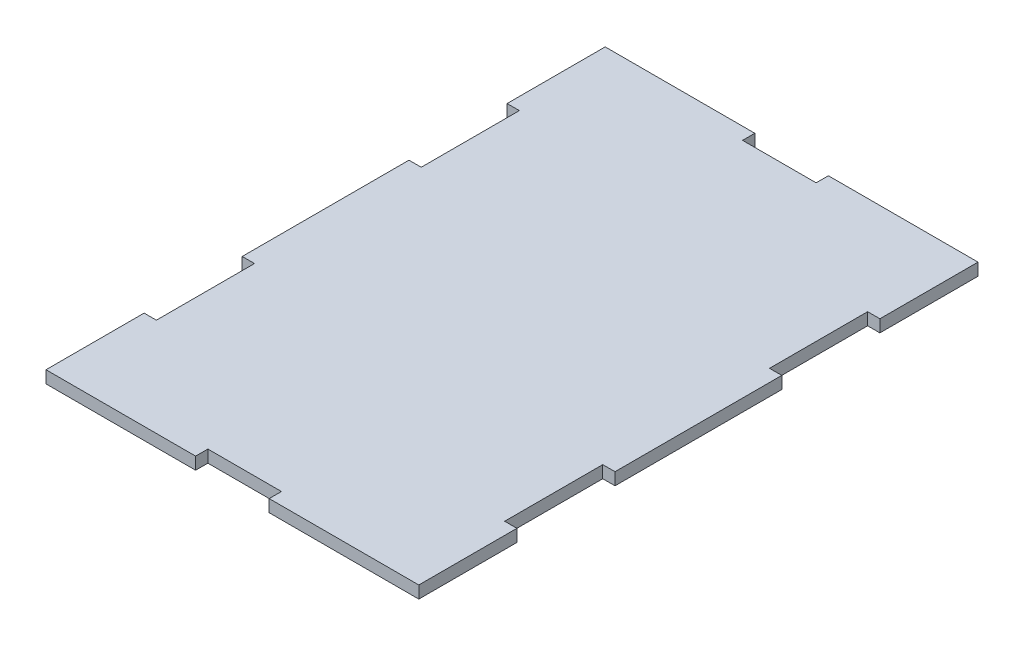
ISO-10303-21;
HEADER;
FILE_DESCRIPTION(('STEP AP214'),'2;1');
FILE_NAME('part.step','',(''),(''),'','','');
FILE_SCHEMA(('AUTOMOTIVE_DESIGN { 1 0 10303 214 1 1 1 1 }'));
ENDSEC;
DATA;
#1=APPLICATION_CONTEXT('core data for automotive mechanical design processes');
#2=APPLICATION_PROTOCOL_DEFINITION('international standard','automotive_design',2000,#1);
#3=PRODUCT_CONTEXT('',#1,'mechanical');
#4=PRODUCT('Part','Part','',(#3));
#5=PRODUCT_RELATED_PRODUCT_CATEGORY('part','',(#4));
#6=PRODUCT_DEFINITION_FORMATION('','',#4);
#7=PRODUCT_DEFINITION_CONTEXT('part definition',#1,'design');
#8=PRODUCT_DEFINITION('design','',#6,#7);
#9=PRODUCT_DEFINITION_SHAPE('','',#8);
#10=(LENGTH_UNIT() NAMED_UNIT(*) SI_UNIT(.MILLI.,.METRE.));
#11=(NAMED_UNIT(*) PLANE_ANGLE_UNIT() SI_UNIT($,.RADIAN.));
#12=(NAMED_UNIT(*) SI_UNIT($,.STERADIAN.) SOLID_ANGLE_UNIT());
#13=UNCERTAINTY_MEASURE_WITH_UNIT(LENGTH_MEASURE(1.E-05),#10,'distance_accuracy_value','');
#14=(GEOMETRIC_REPRESENTATION_CONTEXT(3) GLOBAL_UNCERTAINTY_ASSIGNED_CONTEXT((#13)) GLOBAL_UNIT_ASSIGNED_CONTEXT((#10,
#11,#12)) REPRESENTATION_CONTEXT('',''));
#15=CARTESIAN_POINT('',(0.,0.,0.));
#16=DIRECTION('',(0.,0.,1.));
#17=DIRECTION('',(1.,0.,0.));
#18=AXIS2_PLACEMENT_3D('',#15,#16,#17);
#19=CARTESIAN_POINT('',(0.,3.175,0.));
#20=DIRECTION('',(1.,0.,0.));
#21=DIRECTION('',(0.,0.,-1.));
#22=AXIS2_PLACEMENT_3D('',#19,#20,#21);
#23=PLANE('',#22);
#24=DIRECTION('',(0.,0.,1.));
#25=VECTOR('',#24,1.);
#26=CARTESIAN_POINT('',(0.,0.,0.));
#27=LINE('',#26,#25);
#28=CARTESIAN_POINT('',(0.,0.,-25.4));
#29=VERTEX_POINT('',#28);
#30=CARTESIAN_POINT('',(0.,0.,0.));
#31=VERTEX_POINT('',#30);
#32=EDGE_CURVE('E249',#29,#31,#27,.T.);
#33=ORIENTED_EDGE('',*,*,#32,.T.);
#34=DIRECTION('',(0.,-1.,0.));
#35=VECTOR('',#34,1.);
#36=CARTESIAN_POINT('',(0.,3.175,0.));
#37=LINE('',#36,#35);
#38=CARTESIAN_POINT('',(0.,3.175,0.));
#39=VERTEX_POINT('',#38);
#40=EDGE_CURVE('E11',#39,#31,#37,.T.);
#41=ORIENTED_EDGE('',*,*,#40,.F.);
#42=DIRECTION('',(0.,0.,1.));
#43=VECTOR('',#42,1.);
#44=CARTESIAN_POINT('',(0.,3.175,0.));
#45=LINE('',#44,#43);
#46=CARTESIAN_POINT('',(0.,3.175,-25.4));
#47=VERTEX_POINT('',#46);
#48=EDGE_CURVE('E303',#47,#39,#45,.T.);
#49=ORIENTED_EDGE('',*,*,#48,.F.);
#50=DIRECTION('',(0.,-1.,0.));
#51=VECTOR('',#50,1.);
#52=CARTESIAN_POINT('',(0.,3.175,-25.4));
#53=LINE('',#52,#51);
#54=EDGE_CURVE('E245',#47,#29,#53,.T.);
#55=ORIENTED_EDGE('',*,*,#54,.T.);
#56=EDGE_LOOP('',(#33,#41,#49,#55));
#57=FACE_BOUND('',#56,.T.);
#58=ADVANCED_FACE('F33',(#57),#23,.F.);
#59=CARTESIAN_POINT('',(0.,3.175,0.));
#60=DIRECTION('',(0.,0.,-1.));
#61=DIRECTION('',(-1.,0.,0.));
#62=AXIS2_PLACEMENT_3D('',#59,#60,#61);
#63=PLANE('',#62);
#64=DIRECTION('',(1.,0.,0.));
#65=VECTOR('',#64,1.);
#66=CARTESIAN_POINT('',(0.,0.,0.));
#67=LINE('',#66,#65);
#68=CARTESIAN_POINT('',(38.735,0.,0.));
#69=VERTEX_POINT('',#68);
#70=EDGE_CURVE('E252',#31,#69,#67,.T.);
#71=ORIENTED_EDGE('',*,*,#70,.T.);
#72=DIRECTION('',(0.,-1.,0.));
#73=VECTOR('',#72,1.);
#74=CARTESIAN_POINT('',(38.735,3.175,0.));
#75=LINE('',#74,#73);
#76=CARTESIAN_POINT('',(38.735,3.175,0.));
#77=VERTEX_POINT('',#76);
#78=EDGE_CURVE('E41',#77,#69,#75,.T.);
#79=ORIENTED_EDGE('',*,*,#78,.F.);
#80=DIRECTION('',(1.,0.,0.));
#81=VECTOR('',#80,1.);
#82=CARTESIAN_POINT('',(0.,3.175,0.));
#83=LINE('',#82,#81);
#84=EDGE_CURVE('E152',#39,#77,#83,.T.);
#85=ORIENTED_EDGE('',*,*,#84,.F.);
#86=ORIENTED_EDGE('',*,*,#40,.T.);
#87=EDGE_LOOP('',(#71,#79,#85,#86));
#88=FACE_BOUND('',#87,.T.);
#89=ADVANCED_FACE('F461',(#88),#63,.F.);
#90=CARTESIAN_POINT('',(38.735,3.175,0.));
#91=DIRECTION('',(-1.,0.,0.));
#92=DIRECTION('',(0.,0.,1.));
#93=AXIS2_PLACEMENT_3D('',#90,#91,#92);
#94=PLANE('',#93);
#95=DIRECTION('',(0.,0.,-1.));
#96=VECTOR('',#95,1.);
#97=CARTESIAN_POINT('',(38.735,0.,0.));
#98=LINE('',#97,#96);
#99=CARTESIAN_POINT('',(38.735,0.,-3.17500000000001));
#100=VERTEX_POINT('',#99);
#101=EDGE_CURVE('E254',#69,#100,#98,.T.);
#102=ORIENTED_EDGE('',*,*,#101,.T.);
#103=DIRECTION('',(0.,-1.,0.));
#104=VECTOR('',#103,1.);
#105=CARTESIAN_POINT('',(38.735,3.175,-3.17500000000001));
#106=LINE('',#105,#104);
#107=CARTESIAN_POINT('',(38.735,3.175,-3.17500000000001));
#108=VERTEX_POINT('',#107);
#109=EDGE_CURVE('E370',#108,#100,#106,.T.);
#110=ORIENTED_EDGE('',*,*,#109,.F.);
#111=DIRECTION('',(0.,0.,-1.));
#112=VECTOR('',#111,1.);
#113=CARTESIAN_POINT('',(38.735,3.175,0.));
#114=LINE('',#113,#112);
#115=EDGE_CURVE('E378',#77,#108,#114,.T.);
#116=ORIENTED_EDGE('',*,*,#115,.F.);
#117=ORIENTED_EDGE('',*,*,#78,.T.);
#118=EDGE_LOOP('',(#102,#110,#116,#117));
#119=FACE_BOUND('',#118,.T.);
#120=ADVANCED_FACE('F376',(#119),#94,.F.);
#121=CARTESIAN_POINT('',(38.735,3.175,-3.17500000000001));
#122=DIRECTION('',(0.,0.,-1.));
#123=DIRECTION('',(-1.,0.,0.));
#124=AXIS2_PLACEMENT_3D('',#121,#122,#123);
#125=PLANE('',#124);
#126=DIRECTION('',(1.,0.,0.));
#127=VECTOR('',#126,1.);
#128=CARTESIAN_POINT('',(38.735,0.,-3.17500000000001));
#129=LINE('',#128,#127);
#130=CARTESIAN_POINT('',(57.785,0.,-3.17500000000001));
#131=VERTEX_POINT('',#130);
#132=EDGE_CURVE('E256',#100,#131,#129,.T.);
#133=ORIENTED_EDGE('',*,*,#132,.T.);
#134=DIRECTION('',(0.,-1.,0.));
#135=VECTOR('',#134,1.);
#136=CARTESIAN_POINT('',(57.785,3.175,-3.17500000000001));
#137=LINE('',#136,#135);
#138=CARTESIAN_POINT('',(57.785,3.175,-3.17500000000001));
#139=VERTEX_POINT('',#138);
#140=EDGE_CURVE('E367',#139,#131,#137,.T.);
#141=ORIENTED_EDGE('',*,*,#140,.F.);
#142=DIRECTION('',(1.,0.,0.));
#143=VECTOR('',#142,1.);
#144=CARTESIAN_POINT('',(38.735,3.175,-3.17500000000001));
#145=LINE('',#144,#143);
#146=EDGE_CURVE('E396',#108,#139,#145,.T.);
#147=ORIENTED_EDGE('',*,*,#146,.F.);
#148=ORIENTED_EDGE('',*,*,#109,.T.);
#149=EDGE_LOOP('',(#133,#141,#147,#148));
#150=FACE_BOUND('',#149,.T.);
#151=ADVANCED_FACE('F387',(#150),#125,.F.);
#152=CARTESIAN_POINT('',(57.785,3.175,-3.17500000000001));
#153=DIRECTION('',(1.,0.,0.));
#154=DIRECTION('',(0.,0.,-1.));
#155=AXIS2_PLACEMENT_3D('',#152,#153,#154);
#156=PLANE('',#155);
#157=DIRECTION('',(0.,0.,1.));
#158=VECTOR('',#157,1.);
#159=CARTESIAN_POINT('',(57.785,0.,-3.17500000000001));
#160=LINE('',#159,#158);
#161=CARTESIAN_POINT('',(57.785,0.,0.));
#162=VERTEX_POINT('',#161);
#163=EDGE_CURVE('E258',#131,#162,#160,.T.);
#164=ORIENTED_EDGE('',*,*,#163,.T.);
#165=DIRECTION('',(0.,-1.,0.));
#166=VECTOR('',#165,1.);
#167=CARTESIAN_POINT('',(57.785,3.175,0.));
#168=LINE('',#167,#166);
#169=CARTESIAN_POINT('',(57.785,3.175,0.));
#170=VERTEX_POINT('',#169);
#171=EDGE_CURVE('E364',#170,#162,#168,.T.);
#172=ORIENTED_EDGE('',*,*,#171,.F.);
#173=DIRECTION('',(0.,0.,1.));
#174=VECTOR('',#173,1.);
#175=CARTESIAN_POINT('',(57.785,3.175,-3.17500000000001));
#176=LINE('',#175,#174);
#177=EDGE_CURVE('E393',#139,#170,#176,.T.);
#178=ORIENTED_EDGE('',*,*,#177,.F.);
#179=ORIENTED_EDGE('',*,*,#140,.T.);
#180=EDGE_LOOP('',(#164,#172,#178,#179));
#181=FACE_BOUND('',#180,.T.);
#182=ADVANCED_FACE('F391',(#181),#156,.F.);
#183=CARTESIAN_POINT('',(57.785,3.175,0.));
#184=DIRECTION('',(0.,0.,-1.));
#185=DIRECTION('',(-1.,0.,0.));
#186=AXIS2_PLACEMENT_3D('',#183,#184,#185);
#187=PLANE('',#186);
#188=DIRECTION('',(1.,0.,0.));
#189=VECTOR('',#188,1.);
#190=CARTESIAN_POINT('',(57.785,0.,0.));
#191=LINE('',#190,#189);
#192=CARTESIAN_POINT('',(96.52,0.,0.));
#193=VERTEX_POINT('',#192);
#194=EDGE_CURVE('E260',#162,#193,#191,.T.);
#195=ORIENTED_EDGE('',*,*,#194,.T.);
#196=DIRECTION('',(0.,-1.,0.));
#197=VECTOR('',#196,1.);
#198=CARTESIAN_POINT('',(96.52,3.175,0.));
#199=LINE('',#198,#197);
#200=CARTESIAN_POINT('',(96.52,3.175,0.));
#201=VERTEX_POINT('',#200);
#202=EDGE_CURVE('E361',#201,#193,#199,.T.);
#203=ORIENTED_EDGE('',*,*,#202,.F.);
#204=DIRECTION('',(1.,0.,0.));
#205=VECTOR('',#204,1.);
#206=CARTESIAN_POINT('',(57.785,3.175,0.));
#207=LINE('',#206,#205);
#208=EDGE_CURVE('E395',#170,#201,#207,.T.);
#209=ORIENTED_EDGE('',*,*,#208,.F.);
#210=ORIENTED_EDGE('',*,*,#171,.T.);
#211=EDGE_LOOP('',(#195,#203,#209,#210));
#212=FACE_BOUND('',#211,.T.);
#213=ADVANCED_FACE('F474',(#212),#187,.F.);
#214=CARTESIAN_POINT('',(96.52,3.175,0.));
#215=DIRECTION('',(-1.,0.,0.));
#216=DIRECTION('',(0.,0.,1.));
#217=AXIS2_PLACEMENT_3D('',#214,#215,#216);
#218=PLANE('',#217);
#219=DIRECTION('',(0.,0.,-1.));
#220=VECTOR('',#219,1.);
#221=CARTESIAN_POINT('',(96.52,0.,0.));
#222=LINE('',#221,#220);
#223=CARTESIAN_POINT('',(96.52,0.,-25.4));
#224=VERTEX_POINT('',#223);
#225=EDGE_CURVE('E262',#193,#224,#222,.T.);
#226=ORIENTED_EDGE('',*,*,#225,.T.);
#227=DIRECTION('',(0.,-1.,0.));
#228=VECTOR('',#227,1.);
#229=CARTESIAN_POINT('',(96.52,3.175,-25.4));
#230=LINE('',#229,#228);
#231=CARTESIAN_POINT('',(96.52,3.175,-25.4));
#232=VERTEX_POINT('',#231);
#233=EDGE_CURVE('E358',#232,#224,#230,.T.);
#234=ORIENTED_EDGE('',*,*,#233,.F.);
#235=DIRECTION('',(0.,0.,-1.));
#236=VECTOR('',#235,1.);
#237=CARTESIAN_POINT('',(96.52,3.175,0.));
#238=LINE('',#237,#236);
#239=EDGE_CURVE('E398',#201,#232,#238,.T.);
#240=ORIENTED_EDGE('',*,*,#239,.F.);
#241=ORIENTED_EDGE('',*,*,#202,.T.);
#242=EDGE_LOOP('',(#226,#234,#240,#241));
#243=FACE_BOUND('',#242,.T.);
#244=ADVANCED_FACE('F477',(#243),#218,.F.);
#245=CARTESIAN_POINT('',(96.52,3.175,-25.4));
#246=DIRECTION('',(0.,0.,1.));
#247=DIRECTION('',(1.,0.,0.));
#248=AXIS2_PLACEMENT_3D('',#245,#246,#247);
#249=PLANE('',#248);
#250=DIRECTION('',(-1.,0.,0.));
#251=VECTOR('',#250,1.);
#252=CARTESIAN_POINT('',(96.52,0.,-25.4));
#253=LINE('',#252,#251);
#254=CARTESIAN_POINT('',(93.345,0.,-25.4));
#255=VERTEX_POINT('',#254);
#256=EDGE_CURVE('E264',#224,#255,#253,.T.);
#257=ORIENTED_EDGE('',*,*,#256,.T.);
#258=DIRECTION('',(0.,-1.,0.));
#259=VECTOR('',#258,1.);
#260=CARTESIAN_POINT('',(93.345,3.175,-25.4));
#261=LINE('',#260,#259);
#262=CARTESIAN_POINT('',(93.345,3.175,-25.4));
#263=VERTEX_POINT('',#262);
#264=EDGE_CURVE('E355',#263,#255,#261,.T.);
#265=ORIENTED_EDGE('',*,*,#264,.F.);
#266=DIRECTION('',(-1.,0.,0.));
#267=VECTOR('',#266,1.);
#268=CARTESIAN_POINT('',(96.52,3.175,-25.4));
#269=LINE('',#268,#267);
#270=EDGE_CURVE('E404',#232,#263,#269,.T.);
#271=ORIENTED_EDGE('',*,*,#270,.F.);
#272=ORIENTED_EDGE('',*,*,#233,.T.);
#273=EDGE_LOOP('',(#257,#265,#271,#272));
#274=FACE_BOUND('',#273,.T.);
#275=ADVANCED_FACE('F481',(#274),#249,.F.);
#276=CARTESIAN_POINT('',(93.345,3.175,-25.4));
#277=DIRECTION('',(-1.,0.,0.));
#278=DIRECTION('',(0.,0.,1.));
#279=AXIS2_PLACEMENT_3D('',#276,#277,#278);
#280=PLANE('',#279);
#281=DIRECTION('',(0.,0.,-1.));
#282=VECTOR('',#281,1.);
#283=CARTESIAN_POINT('',(93.345,0.,-25.4));
#284=LINE('',#283,#282);
#285=CARTESIAN_POINT('',(93.345,0.,-50.8));
#286=VERTEX_POINT('',#285);
#287=EDGE_CURVE('E266',#255,#286,#284,.T.);
#288=ORIENTED_EDGE('',*,*,#287,.T.);
#289=DIRECTION('',(0.,-1.,0.));
#290=VECTOR('',#289,1.);
#291=CARTESIAN_POINT('',(93.345,3.175,-50.8));
#292=LINE('',#291,#290);
#293=CARTESIAN_POINT('',(93.345,3.175,-50.8));
#294=VERTEX_POINT('',#293);
#295=EDGE_CURVE('E352',#294,#286,#292,.T.);
#296=ORIENTED_EDGE('',*,*,#295,.F.);
#297=DIRECTION('',(0.,0.,-1.));
#298=VECTOR('',#297,1.);
#299=CARTESIAN_POINT('',(93.345,3.175,-25.4));
#300=LINE('',#299,#298);
#301=EDGE_CURVE('E406',#263,#294,#300,.T.);
#302=ORIENTED_EDGE('',*,*,#301,.F.);
#303=ORIENTED_EDGE('',*,*,#264,.T.);
#304=EDGE_LOOP('',(#288,#296,#302,#303));
#305=FACE_BOUND('',#304,.T.);
#306=ADVANCED_FACE('F485',(#305),#280,.F.);
#307=CARTESIAN_POINT('',(93.345,3.175,-50.8));
#308=DIRECTION('',(0.,0.,-1.));
#309=DIRECTION('',(-1.,0.,0.));
#310=AXIS2_PLACEMENT_3D('',#307,#308,#309);
#311=PLANE('',#310);
#312=DIRECTION('',(1.,0.,0.));
#313=VECTOR('',#312,1.);
#314=CARTESIAN_POINT('',(93.345,0.,-50.8));
#315=LINE('',#314,#313);
#316=CARTESIAN_POINT('',(96.52,0.,-50.8));
#317=VERTEX_POINT('',#316);
#318=EDGE_CURVE('E268',#286,#317,#315,.T.);
#319=ORIENTED_EDGE('',*,*,#318,.T.);
#320=DIRECTION('',(0.,-1.,0.));
#321=VECTOR('',#320,1.);
#322=CARTESIAN_POINT('',(96.52,3.175,-50.8));
#323=LINE('',#322,#321);
#324=CARTESIAN_POINT('',(96.52,3.175,-50.8));
#325=VERTEX_POINT('',#324);
#326=EDGE_CURVE('E349',#325,#317,#323,.T.);
#327=ORIENTED_EDGE('',*,*,#326,.F.);
#328=DIRECTION('',(1.,0.,0.));
#329=VECTOR('',#328,1.);
#330=CARTESIAN_POINT('',(93.345,3.175,-50.8));
#331=LINE('',#330,#329);
#332=EDGE_CURVE('E408',#294,#325,#331,.T.);
#333=ORIENTED_EDGE('',*,*,#332,.F.);
#334=ORIENTED_EDGE('',*,*,#295,.T.);
#335=EDGE_LOOP('',(#319,#327,#333,#334));
#336=FACE_BOUND('',#335,.T.);
#337=ADVANCED_FACE('F489',(#336),#311,.F.);
#338=CARTESIAN_POINT('',(96.52,3.175,-50.8));
#339=DIRECTION('',(-1.,0.,0.));
#340=DIRECTION('',(0.,0.,1.));
#341=AXIS2_PLACEMENT_3D('',#338,#339,#340);
#342=PLANE('',#341);
#343=DIRECTION('',(0.,0.,-1.));
#344=VECTOR('',#343,1.);
#345=CARTESIAN_POINT('',(96.52,0.,-50.8));
#346=LINE('',#345,#344);
#347=CARTESIAN_POINT('',(96.52,0.,-93.98));
#348=VERTEX_POINT('',#347);
#349=EDGE_CURVE('E270',#317,#348,#346,.T.);
#350=ORIENTED_EDGE('',*,*,#349,.T.);
#351=DIRECTION('',(0.,-1.,0.));
#352=VECTOR('',#351,1.);
#353=CARTESIAN_POINT('',(96.52,3.175,-93.98));
#354=LINE('',#353,#352);
#355=CARTESIAN_POINT('',(96.52,3.175,-93.98));
#356=VERTEX_POINT('',#355);
#357=EDGE_CURVE('E346',#356,#348,#354,.T.);
#358=ORIENTED_EDGE('',*,*,#357,.F.);
#359=DIRECTION('',(0.,0.,-1.));
#360=VECTOR('',#359,1.);
#361=CARTESIAN_POINT('',(96.52,3.175,-50.8));
#362=LINE('',#361,#360);
#363=EDGE_CURVE('E410',#325,#356,#362,.T.);
#364=ORIENTED_EDGE('',*,*,#363,.F.);
#365=ORIENTED_EDGE('',*,*,#326,.T.);
#366=EDGE_LOOP('',(#350,#358,#364,#365));
#367=FACE_BOUND('',#366,.T.);
#368=ADVANCED_FACE('F493',(#367),#342,.F.);
#369=CARTESIAN_POINT('',(93.345,3.175,-93.98));
#370=DIRECTION('',(0.,0.,1.));
#371=DIRECTION('',(1.,0.,0.));
#372=AXIS2_PLACEMENT_3D('',#369,#370,#371);
#373=PLANE('',#372);
#374=DIRECTION('',(-1.,0.,0.));
#375=VECTOR('',#374,1.);
#376=CARTESIAN_POINT('',(93.345,0.,-93.98));
#377=LINE('',#376,#375);
#378=CARTESIAN_POINT('',(93.345,0.,-93.98));
#379=VERTEX_POINT('',#378);
#380=EDGE_CURVE('E272',#348,#379,#377,.T.);
#381=ORIENTED_EDGE('',*,*,#380,.T.);
#382=DIRECTION('',(0.,-1.,0.));
#383=VECTOR('',#382,1.);
#384=CARTESIAN_POINT('',(93.345,3.175,-93.98));
#385=LINE('',#384,#383);
#386=CARTESIAN_POINT('',(93.345,3.175,-93.98));
#387=VERTEX_POINT('',#386);
#388=EDGE_CURVE('E343',#387,#379,#385,.T.);
#389=ORIENTED_EDGE('',*,*,#388,.F.);
#390=DIRECTION('',(-1.,0.,0.));
#391=VECTOR('',#390,1.);
#392=CARTESIAN_POINT('',(93.345,3.175,-93.98));
#393=LINE('',#392,#391);
#394=EDGE_CURVE('E412',#356,#387,#393,.T.);
#395=ORIENTED_EDGE('',*,*,#394,.F.);
#396=ORIENTED_EDGE('',*,*,#357,.T.);
#397=EDGE_LOOP('',(#381,#389,#395,#396));
#398=FACE_BOUND('',#397,.T.);
#399=ADVANCED_FACE('F497',(#398),#373,.F.);
#400=CARTESIAN_POINT('',(93.345,3.175,-119.38));
#401=DIRECTION('',(-1.,0.,0.));
#402=DIRECTION('',(0.,0.,1.));
#403=AXIS2_PLACEMENT_3D('',#400,#401,#402);
#404=PLANE('',#403);
#405=DIRECTION('',(0.,0.,-1.));
#406=VECTOR('',#405,1.);
#407=CARTESIAN_POINT('',(93.345,0.,-119.38));
#408=LINE('',#407,#406);
#409=CARTESIAN_POINT('',(93.345,0.,-119.38));
#410=VERTEX_POINT('',#409);
#411=EDGE_CURVE('E274',#379,#410,#408,.T.);
#412=ORIENTED_EDGE('',*,*,#411,.T.);
#413=DIRECTION('',(0.,-1.,0.));
#414=VECTOR('',#413,1.);
#415=CARTESIAN_POINT('',(93.345,3.175,-119.38));
#416=LINE('',#415,#414);
#417=CARTESIAN_POINT('',(93.345,3.175,-119.38));
#418=VERTEX_POINT('',#417);
#419=EDGE_CURVE('E340',#418,#410,#416,.T.);
#420=ORIENTED_EDGE('',*,*,#419,.F.);
#421=DIRECTION('',(0.,0.,-1.));
#422=VECTOR('',#421,1.);
#423=CARTESIAN_POINT('',(93.345,3.175,-119.38));
#424=LINE('',#423,#422);
#425=EDGE_CURVE('E414',#387,#418,#424,.T.);
#426=ORIENTED_EDGE('',*,*,#425,.F.);
#427=ORIENTED_EDGE('',*,*,#388,.T.);
#428=EDGE_LOOP('',(#412,#420,#426,#427));
#429=FACE_BOUND('',#428,.T.);
#430=ADVANCED_FACE('F501',(#429),#404,.F.);
#431=CARTESIAN_POINT('',(96.52,3.175,-119.38));
#432=DIRECTION('',(0.,0.,-1.));
#433=DIRECTION('',(-1.,0.,0.));
#434=AXIS2_PLACEMENT_3D('',#431,#432,#433);
#435=PLANE('',#434);
#436=DIRECTION('',(1.,0.,0.));
#437=VECTOR('',#436,1.);
#438=CARTESIAN_POINT('',(96.52,0.,-119.38));
#439=LINE('',#438,#437);
#440=CARTESIAN_POINT('',(96.52,0.,-119.38));
#441=VERTEX_POINT('',#440);
#442=EDGE_CURVE('E276',#410,#441,#439,.T.);
#443=ORIENTED_EDGE('',*,*,#442,.T.);
#444=DIRECTION('',(0.,-1.,0.));
#445=VECTOR('',#444,1.);
#446=CARTESIAN_POINT('',(96.52,3.175,-119.38));
#447=LINE('',#446,#445);
#448=CARTESIAN_POINT('',(96.52,3.175,-119.38));
#449=VERTEX_POINT('',#448);
#450=EDGE_CURVE('E337',#449,#441,#447,.T.);
#451=ORIENTED_EDGE('',*,*,#450,.F.);
#452=DIRECTION('',(1.,0.,0.));
#453=VECTOR('',#452,1.);
#454=CARTESIAN_POINT('',(96.52,3.175,-119.38));
#455=LINE('',#454,#453);
#456=EDGE_CURVE('E416',#418,#449,#455,.T.);
#457=ORIENTED_EDGE('',*,*,#456,.F.);
#458=ORIENTED_EDGE('',*,*,#419,.T.);
#459=EDGE_LOOP('',(#443,#451,#457,#458));
#460=FACE_BOUND('',#459,.T.);
#461=ADVANCED_FACE('F505',(#460),#435,.F.);
#462=CARTESIAN_POINT('',(96.52,3.175,-119.38));
#463=DIRECTION('',(-1.,0.,0.));
#464=DIRECTION('',(0.,0.,1.));
#465=AXIS2_PLACEMENT_3D('',#462,#463,#464);
#466=PLANE('',#465);
#467=DIRECTION('',(0.,0.,-1.));
#468=VECTOR('',#467,1.);
#469=CARTESIAN_POINT('',(96.52,0.,-119.38));
#470=LINE('',#469,#468);
#471=CARTESIAN_POINT('',(96.52,0.,-144.78));
#472=VERTEX_POINT('',#471);
#473=EDGE_CURVE('E278',#441,#472,#470,.T.);
#474=ORIENTED_EDGE('',*,*,#473,.T.);
#475=DIRECTION('',(0.,-1.,0.));
#476=VECTOR('',#475,1.);
#477=CARTESIAN_POINT('',(96.52,3.175,-144.78));
#478=LINE('',#477,#476);
#479=CARTESIAN_POINT('',(96.52,3.175,-144.78));
#480=VERTEX_POINT('',#479);
#481=EDGE_CURVE('E334',#480,#472,#478,.T.);
#482=ORIENTED_EDGE('',*,*,#481,.F.);
#483=DIRECTION('',(0.,0.,-1.));
#484=VECTOR('',#483,1.);
#485=CARTESIAN_POINT('',(96.52,3.175,-119.38));
#486=LINE('',#485,#484);
#487=EDGE_CURVE('E418',#449,#480,#486,.T.);
#488=ORIENTED_EDGE('',*,*,#487,.F.);
#489=ORIENTED_EDGE('',*,*,#450,.T.);
#490=EDGE_LOOP('',(#474,#482,#488,#489));
#491=FACE_BOUND('',#490,.T.);
#492=ADVANCED_FACE('F509',(#491),#466,.F.);
#493=CARTESIAN_POINT('',(57.785,3.175,-144.78));
#494=DIRECTION('',(0.,0.,1.));
#495=DIRECTION('',(1.,0.,0.));
#496=AXIS2_PLACEMENT_3D('',#493,#494,#495);
#497=PLANE('',#496);
#498=DIRECTION('',(-1.,0.,0.));
#499=VECTOR('',#498,1.);
#500=CARTESIAN_POINT('',(57.785,0.,-144.78));
#501=LINE('',#500,#499);
#502=CARTESIAN_POINT('',(57.785,0.,-144.78));
#503=VERTEX_POINT('',#502);
#504=EDGE_CURVE('E280',#472,#503,#501,.T.);
#505=ORIENTED_EDGE('',*,*,#504,.T.);
#506=DIRECTION('',(0.,-1.,0.));
#507=VECTOR('',#506,1.);
#508=CARTESIAN_POINT('',(57.785,3.175,-144.78));
#509=LINE('',#508,#507);
#510=CARTESIAN_POINT('',(57.785,3.175,-144.78));
#511=VERTEX_POINT('',#510);
#512=EDGE_CURVE('E331',#511,#503,#509,.T.);
#513=ORIENTED_EDGE('',*,*,#512,.F.);
#514=DIRECTION('',(-1.,0.,0.));
#515=VECTOR('',#514,1.);
#516=CARTESIAN_POINT('',(57.785,3.175,-144.78));
#517=LINE('',#516,#515);
#518=EDGE_CURVE('E420',#480,#511,#517,.T.);
#519=ORIENTED_EDGE('',*,*,#518,.F.);
#520=ORIENTED_EDGE('',*,*,#481,.T.);
#521=EDGE_LOOP('',(#505,#513,#519,#520));
#522=FACE_BOUND('',#521,.T.);
#523=ADVANCED_FACE('F513',(#522),#497,.F.);
#524=CARTESIAN_POINT('',(57.785,3.175,-141.605));
#525=DIRECTION('',(1.,0.,0.));
#526=DIRECTION('',(0.,0.,-1.));
#527=AXIS2_PLACEMENT_3D('',#524,#525,#526);
#528=PLANE('',#527);
#529=DIRECTION('',(0.,0.,1.));
#530=VECTOR('',#529,1.);
#531=CARTESIAN_POINT('',(57.785,0.,-141.605));
#532=LINE('',#531,#530);
#533=CARTESIAN_POINT('',(57.785,0.,-141.605));
#534=VERTEX_POINT('',#533);
#535=EDGE_CURVE('E282',#503,#534,#532,.T.);
#536=ORIENTED_EDGE('',*,*,#535,.T.);
#537=DIRECTION('',(0.,-1.,0.));
#538=VECTOR('',#537,1.);
#539=CARTESIAN_POINT('',(57.785,3.175,-141.605));
#540=LINE('',#539,#538);
#541=CARTESIAN_POINT('',(57.785,3.175,-141.605));
#542=VERTEX_POINT('',#541);
#543=EDGE_CURVE('E328',#542,#534,#540,.T.);
#544=ORIENTED_EDGE('',*,*,#543,.F.);
#545=DIRECTION('',(0.,0.,1.));
#546=VECTOR('',#545,1.);
#547=CARTESIAN_POINT('',(57.785,3.175,-141.605));
#548=LINE('',#547,#546);
#549=EDGE_CURVE('E422',#511,#542,#548,.T.);
#550=ORIENTED_EDGE('',*,*,#549,.F.);
#551=ORIENTED_EDGE('',*,*,#512,.T.);
#552=EDGE_LOOP('',(#536,#544,#550,#551));
#553=FACE_BOUND('',#552,.T.);
#554=ADVANCED_FACE('F517',(#553),#528,.F.);
#555=CARTESIAN_POINT('',(38.735,3.175,-141.605));
#556=DIRECTION('',(0.,0.,1.));
#557=DIRECTION('',(1.,0.,0.));
#558=AXIS2_PLACEMENT_3D('',#555,#556,#557);
#559=PLANE('',#558);
#560=DIRECTION('',(-1.,0.,0.));
#561=VECTOR('',#560,1.);
#562=CARTESIAN_POINT('',(38.735,0.,-141.605));
#563=LINE('',#562,#561);
#564=CARTESIAN_POINT('',(38.735,0.,-141.605));
#565=VERTEX_POINT('',#564);
#566=EDGE_CURVE('E284',#534,#565,#563,.T.);
#567=ORIENTED_EDGE('',*,*,#566,.T.);
#568=DIRECTION('',(0.,-1.,0.));
#569=VECTOR('',#568,1.);
#570=CARTESIAN_POINT('',(38.735,3.175,-141.605));
#571=LINE('',#570,#569);
#572=CARTESIAN_POINT('',(38.735,3.175,-141.605));
#573=VERTEX_POINT('',#572);
#574=EDGE_CURVE('E325',#573,#565,#571,.T.);
#575=ORIENTED_EDGE('',*,*,#574,.F.);
#576=DIRECTION('',(-1.,0.,0.));
#577=VECTOR('',#576,1.);
#578=CARTESIAN_POINT('',(38.735,3.175,-141.605));
#579=LINE('',#578,#577);
#580=EDGE_CURVE('E424',#542,#573,#579,.T.);
#581=ORIENTED_EDGE('',*,*,#580,.F.);
#582=ORIENTED_EDGE('',*,*,#543,.T.);
#583=EDGE_LOOP('',(#567,#575,#581,#582));
#584=FACE_BOUND('',#583,.T.);
#585=ADVANCED_FACE('F521',(#584),#559,.F.);
#586=CARTESIAN_POINT('',(38.735,3.175,-144.78));
#587=DIRECTION('',(-1.,0.,0.));
#588=DIRECTION('',(0.,0.,1.));
#589=AXIS2_PLACEMENT_3D('',#586,#587,#588);
#590=PLANE('',#589);
#591=DIRECTION('',(0.,0.,-1.));
#592=VECTOR('',#591,1.);
#593=CARTESIAN_POINT('',(38.735,0.,-144.78));
#594=LINE('',#593,#592);
#595=CARTESIAN_POINT('',(38.735,0.,-144.78));
#596=VERTEX_POINT('',#595);
#597=EDGE_CURVE('E286',#565,#596,#594,.T.);
#598=ORIENTED_EDGE('',*,*,#597,.T.);
#599=DIRECTION('',(0.,-1.,0.));
#600=VECTOR('',#599,1.);
#601=CARTESIAN_POINT('',(38.735,3.175,-144.78));
#602=LINE('',#601,#600);
#603=CARTESIAN_POINT('',(38.735,3.175,-144.78));
#604=VERTEX_POINT('',#603);
#605=EDGE_CURVE('E322',#604,#596,#602,.T.);
#606=ORIENTED_EDGE('',*,*,#605,.F.);
#607=DIRECTION('',(0.,0.,-1.));
#608=VECTOR('',#607,1.);
#609=CARTESIAN_POINT('',(38.735,3.175,-144.78));
#610=LINE('',#609,#608);
#611=EDGE_CURVE('E426',#573,#604,#610,.T.);
#612=ORIENTED_EDGE('',*,*,#611,.F.);
#613=ORIENTED_EDGE('',*,*,#574,.T.);
#614=EDGE_LOOP('',(#598,#606,#612,#613));
#615=FACE_BOUND('',#614,.T.);
#616=ADVANCED_FACE('F525',(#615),#590,.F.);
#617=CARTESIAN_POINT('',(0.,3.175,-144.78));
#618=DIRECTION('',(0.,0.,1.));
#619=DIRECTION('',(1.,0.,0.));
#620=AXIS2_PLACEMENT_3D('',#617,#618,#619);
#621=PLANE('',#620);
#622=DIRECTION('',(-1.,0.,0.));
#623=VECTOR('',#622,1.);
#624=CARTESIAN_POINT('',(0.,0.,-144.78));
#625=LINE('',#624,#623);
#626=CARTESIAN_POINT('',(0.,0.,-144.78));
#627=VERTEX_POINT('',#626);
#628=EDGE_CURVE('E288',#596,#627,#625,.T.);
#629=ORIENTED_EDGE('',*,*,#628,.T.);
#630=DIRECTION('',(0.,-1.,0.));
#631=VECTOR('',#630,1.);
#632=CARTESIAN_POINT('',(0.,3.175,-144.78));
#633=LINE('',#632,#631);
#634=CARTESIAN_POINT('',(0.,3.175,-144.78));
#635=VERTEX_POINT('',#634);
#636=EDGE_CURVE('E319',#635,#627,#633,.T.);
#637=ORIENTED_EDGE('',*,*,#636,.F.);
#638=DIRECTION('',(-1.,0.,0.));
#639=VECTOR('',#638,1.);
#640=CARTESIAN_POINT('',(0.,3.175,-144.78));
#641=LINE('',#640,#639);
#642=EDGE_CURVE('E428',#604,#635,#641,.T.);
#643=ORIENTED_EDGE('',*,*,#642,.F.);
#644=ORIENTED_EDGE('',*,*,#605,.T.);
#645=EDGE_LOOP('',(#629,#637,#643,#644));
#646=FACE_BOUND('',#645,.T.);
#647=ADVANCED_FACE('F529',(#646),#621,.F.);
#648=CARTESIAN_POINT('',(0.,3.175,-119.38));
#649=DIRECTION('',(1.,0.,0.));
#650=DIRECTION('',(0.,0.,-1.));
#651=AXIS2_PLACEMENT_3D('',#648,#649,#650);
#652=PLANE('',#651);
#653=DIRECTION('',(0.,0.,1.));
#654=VECTOR('',#653,1.);
#655=CARTESIAN_POINT('',(0.,0.,-119.38));
#656=LINE('',#655,#654);
#657=CARTESIAN_POINT('',(0.,0.,-119.38));
#658=VERTEX_POINT('',#657);
#659=EDGE_CURVE('E290',#627,#658,#656,.T.);
#660=ORIENTED_EDGE('',*,*,#659,.T.);
#661=DIRECTION('',(0.,-1.,0.));
#662=VECTOR('',#661,1.);
#663=CARTESIAN_POINT('',(0.,3.175,-119.38));
#664=LINE('',#663,#662);
#665=CARTESIAN_POINT('',(0.,3.175,-119.38));
#666=VERTEX_POINT('',#665);
#667=EDGE_CURVE('E316',#666,#658,#664,.T.);
#668=ORIENTED_EDGE('',*,*,#667,.F.);
#669=DIRECTION('',(0.,0.,1.));
#670=VECTOR('',#669,1.);
#671=CARTESIAN_POINT('',(0.,3.175,-119.38));
#672=LINE('',#671,#670);
#673=EDGE_CURVE('E430',#635,#666,#672,.T.);
#674=ORIENTED_EDGE('',*,*,#673,.F.);
#675=ORIENTED_EDGE('',*,*,#636,.T.);
#676=EDGE_LOOP('',(#660,#668,#674,#675));
#677=FACE_BOUND('',#676,.T.);
#678=ADVANCED_FACE('F533',(#677),#652,.F.);
#679=CARTESIAN_POINT('',(0.,3.175,-119.38));
#680=DIRECTION('',(0.,0.,-1.));
#681=DIRECTION('',(-1.,0.,0.));
#682=AXIS2_PLACEMENT_3D('',#679,#680,#681);
#683=PLANE('',#682);
#684=DIRECTION('',(1.,0.,0.));
#685=VECTOR('',#684,1.);
#686=CARTESIAN_POINT('',(0.,0.,-119.38));
#687=LINE('',#686,#685);
#688=CARTESIAN_POINT('',(3.175,0.,-119.38));
#689=VERTEX_POINT('',#688);
#690=EDGE_CURVE('E292',#658,#689,#687,.T.);
#691=ORIENTED_EDGE('',*,*,#690,.T.);
#692=DIRECTION('',(0.,-1.,0.));
#693=VECTOR('',#692,1.);
#694=CARTESIAN_POINT('',(3.175,3.175,-119.38));
#695=LINE('',#694,#693);
#696=CARTESIAN_POINT('',(3.175,3.175,-119.38));
#697=VERTEX_POINT('',#696);
#698=EDGE_CURVE('E313',#697,#689,#695,.T.);
#699=ORIENTED_EDGE('',*,*,#698,.F.);
#700=DIRECTION('',(1.,0.,0.));
#701=VECTOR('',#700,1.);
#702=CARTESIAN_POINT('',(0.,3.175,-119.38));
#703=LINE('',#702,#701);
#704=EDGE_CURVE('E432',#666,#697,#703,.T.);
#705=ORIENTED_EDGE('',*,*,#704,.F.);
#706=ORIENTED_EDGE('',*,*,#667,.T.);
#707=EDGE_LOOP('',(#691,#699,#705,#706));
#708=FACE_BOUND('',#707,.T.);
#709=ADVANCED_FACE('F537',(#708),#683,.F.);
#710=CARTESIAN_POINT('',(3.175,3.175,-119.38));
#711=DIRECTION('',(1.,0.,0.));
#712=DIRECTION('',(0.,0.,-1.));
#713=AXIS2_PLACEMENT_3D('',#710,#711,#712);
#714=PLANE('',#713);
#715=DIRECTION('',(0.,0.,1.));
#716=VECTOR('',#715,1.);
#717=CARTESIAN_POINT('',(3.175,0.,-119.38));
#718=LINE('',#717,#716);
#719=CARTESIAN_POINT('',(3.175,0.,-93.98));
#720=VERTEX_POINT('',#719);
#721=EDGE_CURVE('E294',#689,#720,#718,.T.);
#722=ORIENTED_EDGE('',*,*,#721,.T.);
#723=DIRECTION('',(0.,-1.,0.));
#724=VECTOR('',#723,1.);
#725=CARTESIAN_POINT('',(3.175,3.175,-93.98));
#726=LINE('',#725,#724);
#727=CARTESIAN_POINT('',(3.175,3.175,-93.98));
#728=VERTEX_POINT('',#727);
#729=EDGE_CURVE('E310',#728,#720,#726,.T.);
#730=ORIENTED_EDGE('',*,*,#729,.F.);
#731=DIRECTION('',(0.,0.,1.));
#732=VECTOR('',#731,1.);
#733=CARTESIAN_POINT('',(3.175,3.175,-119.38));
#734=LINE('',#733,#732);
#735=EDGE_CURVE('E434',#697,#728,#734,.T.);
#736=ORIENTED_EDGE('',*,*,#735,.F.);
#737=ORIENTED_EDGE('',*,*,#698,.T.);
#738=EDGE_LOOP('',(#722,#730,#736,#737));
#739=FACE_BOUND('',#738,.T.);
#740=ADVANCED_FACE('F541',(#739),#714,.F.);
#741=CARTESIAN_POINT('',(3.175,3.175,-93.98));
#742=DIRECTION('',(0.,0.,1.));
#743=DIRECTION('',(1.,0.,0.));
#744=AXIS2_PLACEMENT_3D('',#741,#742,#743);
#745=PLANE('',#744);
#746=DIRECTION('',(-1.,0.,0.));
#747=VECTOR('',#746,1.);
#748=CARTESIAN_POINT('',(3.175,0.,-93.98));
#749=LINE('',#748,#747);
#750=CARTESIAN_POINT('',(0.,0.,-93.98));
#751=VERTEX_POINT('',#750);
#752=EDGE_CURVE('E296',#720,#751,#749,.T.);
#753=ORIENTED_EDGE('',*,*,#752,.T.);
#754=DIRECTION('',(0.,-1.,0.));
#755=VECTOR('',#754,1.);
#756=CARTESIAN_POINT('',(0.,3.175,-93.98));
#757=LINE('',#756,#755);
#758=CARTESIAN_POINT('',(0.,3.175,-93.98));
#759=VERTEX_POINT('',#758);
#760=EDGE_CURVE('E307',#759,#751,#757,.T.);
#761=ORIENTED_EDGE('',*,*,#760,.F.);
#762=DIRECTION('',(-1.,0.,0.));
#763=VECTOR('',#762,1.);
#764=CARTESIAN_POINT('',(3.175,3.175,-93.98));
#765=LINE('',#764,#763);
#766=EDGE_CURVE('E436',#728,#759,#765,.T.);
#767=ORIENTED_EDGE('',*,*,#766,.F.);
#768=ORIENTED_EDGE('',*,*,#729,.T.);
#769=EDGE_LOOP('',(#753,#761,#767,#768));
#770=FACE_BOUND('',#769,.T.);
#771=ADVANCED_FACE('F442',(#770),#745,.F.);
#772=CARTESIAN_POINT('',(0.,3.175,-50.8));
#773=DIRECTION('',(1.,0.,0.));
#774=DIRECTION('',(0.,0.,-1.));
#775=AXIS2_PLACEMENT_3D('',#772,#773,#774);
#776=PLANE('',#775);
#777=DIRECTION('',(0.,0.,1.));
#778=VECTOR('',#777,1.);
#779=CARTESIAN_POINT('',(0.,0.,-50.8));
#780=LINE('',#779,#778);
#781=CARTESIAN_POINT('',(0.,0.,-50.8));
#782=VERTEX_POINT('',#781);
#783=EDGE_CURVE('E298',#751,#782,#780,.T.);
#784=ORIENTED_EDGE('',*,*,#783,.T.);
#785=DIRECTION('',(0.,-1.,0.));
#786=VECTOR('',#785,1.);
#787=CARTESIAN_POINT('',(0.,3.175,-50.8));
#788=LINE('',#787,#786);
#789=CARTESIAN_POINT('',(0.,3.175,-50.8));
#790=VERTEX_POINT('',#789);
#791=EDGE_CURVE('E240',#790,#782,#788,.T.);
#792=ORIENTED_EDGE('',*,*,#791,.F.);
#793=DIRECTION('',(0.,0.,1.));
#794=VECTOR('',#793,1.);
#795=CARTESIAN_POINT('',(0.,3.175,-50.8));
#796=LINE('',#795,#794);
#797=EDGE_CURVE('E231',#759,#790,#796,.T.);
#798=ORIENTED_EDGE('',*,*,#797,.F.);
#799=ORIENTED_EDGE('',*,*,#760,.T.);
#800=EDGE_LOOP('',(#784,#792,#798,#799));
#801=FACE_BOUND('',#800,.T.);
#802=ADVANCED_FACE('F446',(#801),#776,.F.);
#803=CARTESIAN_POINT('',(3.175,3.175,-50.8));
#804=DIRECTION('',(0.,0.,-1.));
#805=DIRECTION('',(-1.,0.,0.));
#806=AXIS2_PLACEMENT_3D('',#803,#804,#805);
#807=PLANE('',#806);
#808=DIRECTION('',(1.,0.,0.));
#809=VECTOR('',#808,1.);
#810=CARTESIAN_POINT('',(3.175,0.,-50.8));
#811=LINE('',#810,#809);
#812=CARTESIAN_POINT('',(3.175,0.,-50.8));
#813=VERTEX_POINT('',#812);
#814=EDGE_CURVE('E239',#782,#813,#811,.T.);
#815=ORIENTED_EDGE('',*,*,#814,.T.);
#816=DIRECTION('',(0.,-1.,0.));
#817=VECTOR('',#816,1.);
#818=CARTESIAN_POINT('',(3.175,3.175,-50.8));
#819=LINE('',#818,#817);
#820=CARTESIAN_POINT('',(3.175,3.175,-50.8));
#821=VERTEX_POINT('',#820);
#822=EDGE_CURVE('E236',#821,#813,#819,.T.);
#823=ORIENTED_EDGE('',*,*,#822,.F.);
#824=DIRECTION('',(1.,0.,0.));
#825=VECTOR('',#824,1.);
#826=CARTESIAN_POINT('',(3.175,3.175,-50.8));
#827=LINE('',#826,#825);
#828=EDGE_CURVE('E225',#790,#821,#827,.T.);
#829=ORIENTED_EDGE('',*,*,#828,.F.);
#830=ORIENTED_EDGE('',*,*,#791,.T.);
#831=EDGE_LOOP('',(#815,#823,#829,#830));
#832=FACE_BOUND('',#831,.T.);
#833=ADVANCED_FACE('F237',(#832),#807,.F.);
#834=CARTESIAN_POINT('',(3.175,3.175,-25.4));
#835=DIRECTION('',(1.,0.,0.));
#836=DIRECTION('',(0.,0.,-1.));
#837=AXIS2_PLACEMENT_3D('',#834,#835,#836);
#838=PLANE('',#837);
#839=DIRECTION('',(0.,0.,1.));
#840=VECTOR('',#839,1.);
#841=CARTESIAN_POINT('',(3.175,0.,-25.4));
#842=LINE('',#841,#840);
#843=CARTESIAN_POINT('',(3.175,0.,-25.4));
#844=VERTEX_POINT('',#843);
#845=EDGE_CURVE('E138',#813,#844,#842,.T.);
#846=ORIENTED_EDGE('',*,*,#845,.T.);
#847=DIRECTION('',(0.,-1.,0.));
#848=VECTOR('',#847,1.);
#849=CARTESIAN_POINT('',(3.175,3.175,-25.4));
#850=LINE('',#849,#848);
#851=CARTESIAN_POINT('',(3.175,3.175,-25.4));
#852=VERTEX_POINT('',#851);
#853=EDGE_CURVE('E241',#852,#844,#850,.T.);
#854=ORIENTED_EDGE('',*,*,#853,.F.);
#855=DIRECTION('',(0.,0.,1.));
#856=VECTOR('',#855,1.);
#857=CARTESIAN_POINT('',(3.175,3.175,-25.4));
#858=LINE('',#857,#856);
#859=EDGE_CURVE('E229',#821,#852,#858,.T.);
#860=ORIENTED_EDGE('',*,*,#859,.F.);
#861=ORIENTED_EDGE('',*,*,#822,.T.);
#862=EDGE_LOOP('',(#846,#854,#860,#861));
#863=FACE_BOUND('',#862,.T.);
#864=ADVANCED_FACE('F243',(#863),#838,.F.);
#865=CARTESIAN_POINT('',(0.,3.175,-25.4));
#866=DIRECTION('',(0.,0.,1.));
#867=DIRECTION('',(1.,0.,0.));
#868=AXIS2_PLACEMENT_3D('',#865,#866,#867);
#869=PLANE('',#868);
#870=DIRECTION('',(-1.,0.,0.));
#871=VECTOR('',#870,1.);
#872=CARTESIAN_POINT('',(0.,0.,-25.4));
#873=LINE('',#872,#871);
#874=EDGE_CURVE('E144',#844,#29,#873,.T.);
#875=ORIENTED_EDGE('',*,*,#874,.T.);
#876=ORIENTED_EDGE('',*,*,#54,.F.);
#877=DIRECTION('',(-1.,0.,0.));
#878=VECTOR('',#877,1.);
#879=CARTESIAN_POINT('',(0.,3.175,-25.4));
#880=LINE('',#879,#878);
#881=EDGE_CURVE('E49',#852,#47,#880,.T.);
#882=ORIENTED_EDGE('',*,*,#881,.F.);
#883=ORIENTED_EDGE('',*,*,#853,.T.);
#884=EDGE_LOOP('',(#875,#876,#882,#883));
#885=FACE_BOUND('',#884,.T.);
#886=ADVANCED_FACE('F450',(#885),#869,.F.);
#887=CARTESIAN_POINT('',(0.,3.175,0.));
#888=DIRECTION('',(0.,-1.,0.));
#889=DIRECTION('',(0.,0.,-1.));
#890=AXIS2_PLACEMENT_3D('',#887,#888,#889);
#891=PLANE('',#890);
#892=ORIENTED_EDGE('',*,*,#48,.T.);
#893=ORIENTED_EDGE('',*,*,#84,.T.);
#894=ORIENTED_EDGE('',*,*,#115,.T.);
#895=ORIENTED_EDGE('',*,*,#146,.T.);
#896=ORIENTED_EDGE('',*,*,#177,.T.);
#897=ORIENTED_EDGE('',*,*,#208,.T.);
#898=ORIENTED_EDGE('',*,*,#239,.T.);
#899=ORIENTED_EDGE('',*,*,#270,.T.);
#900=ORIENTED_EDGE('',*,*,#301,.T.);
#901=ORIENTED_EDGE('',*,*,#332,.T.);
#902=ORIENTED_EDGE('',*,*,#363,.T.);
#903=ORIENTED_EDGE('',*,*,#394,.T.);
#904=ORIENTED_EDGE('',*,*,#425,.T.);
#905=ORIENTED_EDGE('',*,*,#456,.T.);
#906=ORIENTED_EDGE('',*,*,#487,.T.);
#907=ORIENTED_EDGE('',*,*,#518,.T.);
#908=ORIENTED_EDGE('',*,*,#549,.T.);
#909=ORIENTED_EDGE('',*,*,#580,.T.);
#910=ORIENTED_EDGE('',*,*,#611,.T.);
#911=ORIENTED_EDGE('',*,*,#642,.T.);
#912=ORIENTED_EDGE('',*,*,#673,.T.);
#913=ORIENTED_EDGE('',*,*,#704,.T.);
#914=ORIENTED_EDGE('',*,*,#735,.T.);
#915=ORIENTED_EDGE('',*,*,#766,.T.);
#916=ORIENTED_EDGE('',*,*,#797,.T.);
#917=ORIENTED_EDGE('',*,*,#828,.T.);
#918=ORIENTED_EDGE('',*,*,#859,.T.);
#919=ORIENTED_EDGE('',*,*,#881,.T.);
#920=EDGE_LOOP('',(#892,#893,#894,#895,#896,#897,#898,#899,#900,#901,#902,#903,#904,#905,#906,
#907,#908,#909,#910,#911,#912,#913,#914,#915,#916,#917,#918,#919));
#921=FACE_BOUND('',#920,.T.);
#922=ADVANCED_FACE('F227',(#921),#891,.F.);
#923=CARTESIAN_POINT('',(0.,0.,0.));
#924=DIRECTION('',(0.,-1.,0.));
#925=DIRECTION('',(0.,0.,-1.));
#926=AXIS2_PLACEMENT_3D('',#923,#924,#925);
#927=PLANE('',#926);
#928=ORIENTED_EDGE('',*,*,#32,.F.);
#929=ORIENTED_EDGE('',*,*,#874,.F.);
#930=ORIENTED_EDGE('',*,*,#845,.F.);
#931=ORIENTED_EDGE('',*,*,#814,.F.);
#932=ORIENTED_EDGE('',*,*,#783,.F.);
#933=ORIENTED_EDGE('',*,*,#752,.F.);
#934=ORIENTED_EDGE('',*,*,#721,.F.);
#935=ORIENTED_EDGE('',*,*,#690,.F.);
#936=ORIENTED_EDGE('',*,*,#659,.F.);
#937=ORIENTED_EDGE('',*,*,#628,.F.);
#938=ORIENTED_EDGE('',*,*,#597,.F.);
#939=ORIENTED_EDGE('',*,*,#566,.F.);
#940=ORIENTED_EDGE('',*,*,#535,.F.);
#941=ORIENTED_EDGE('',*,*,#504,.F.);
#942=ORIENTED_EDGE('',*,*,#473,.F.);
#943=ORIENTED_EDGE('',*,*,#442,.F.);
#944=ORIENTED_EDGE('',*,*,#411,.F.);
#945=ORIENTED_EDGE('',*,*,#380,.F.);
#946=ORIENTED_EDGE('',*,*,#349,.F.);
#947=ORIENTED_EDGE('',*,*,#318,.F.);
#948=ORIENTED_EDGE('',*,*,#287,.F.);
#949=ORIENTED_EDGE('',*,*,#256,.F.);
#950=ORIENTED_EDGE('',*,*,#225,.F.);
#951=ORIENTED_EDGE('',*,*,#194,.F.);
#952=ORIENTED_EDGE('',*,*,#163,.F.);
#953=ORIENTED_EDGE('',*,*,#132,.F.);
#954=ORIENTED_EDGE('',*,*,#101,.F.);
#955=ORIENTED_EDGE('',*,*,#70,.F.);
#956=EDGE_LOOP('',(#928,#929,#930,#931,#932,#933,#934,#935,#936,#937,#938,#939,#940,#941,#942,
#943,#944,#945,#946,#947,#948,#949,#950,#951,#952,#953,#954,#955));
#957=FACE_BOUND('',#956,.T.);
#958=ADVANCED_FACE('F382',(#957),#927,.T.);
#959=CLOSED_SHELL('',(#58,#89,#120,#151,#182,#213,#244,#275,#306,#337,#368,#399,#430,#461,#492,
#523,#554,#585,#616,#647,#678,#709,#740,#771,#802,#833,#864,#886,#922,#958));
#960=MANIFOLD_SOLID_BREP('B2',#959);
#961=ADVANCED_BREP_SHAPE_REPRESENTATION('',(#18,#960),#14);
#962=SHAPE_DEFINITION_REPRESENTATION(#9,#961);
ENDSEC;
END-ISO-10303-21;
